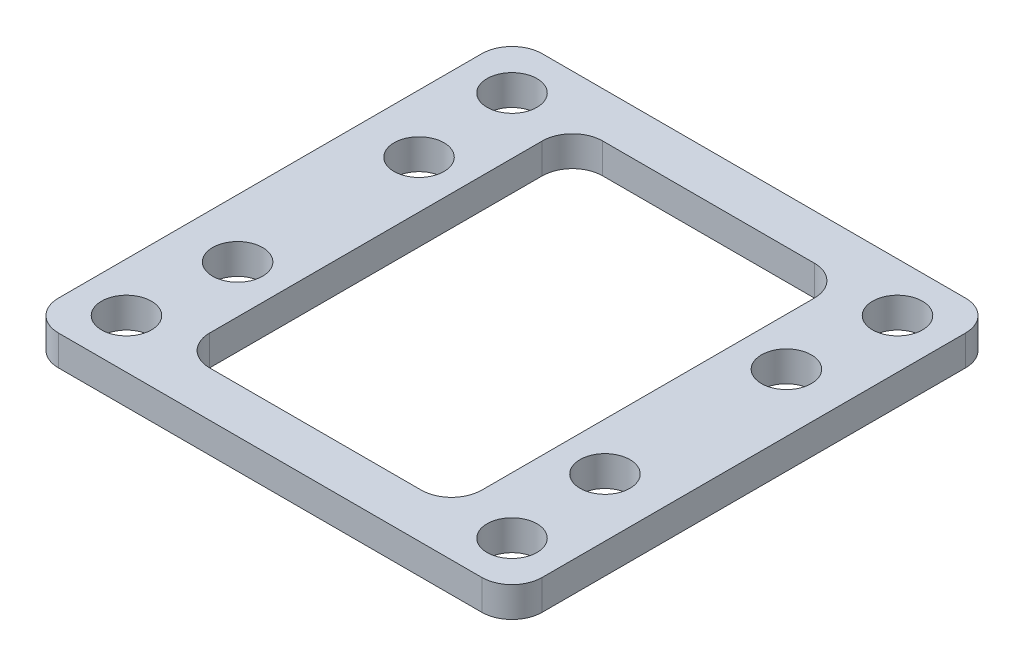
ISO-10303-21;
HEADER;
FILE_DESCRIPTION(('STEP AP214'),'2;1');
FILE_NAME('part.step','',(''),(''),'','','');
FILE_SCHEMA(('AUTOMOTIVE_DESIGN { 1 0 10303 214 1 1 1 1 }'));
ENDSEC;
DATA;
#1=APPLICATION_CONTEXT('core data for automotive mechanical design processes');
#2=APPLICATION_PROTOCOL_DEFINITION('international standard','automotive_design',2000,#1);
#3=PRODUCT_CONTEXT('',#1,'mechanical');
#4=PRODUCT('Part','Part','',(#3));
#5=PRODUCT_RELATED_PRODUCT_CATEGORY('part','',(#4));
#6=PRODUCT_DEFINITION_FORMATION('','',#4);
#7=PRODUCT_DEFINITION_CONTEXT('part definition',#1,'design');
#8=PRODUCT_DEFINITION('design','',#6,#7);
#9=PRODUCT_DEFINITION_SHAPE('','',#8);
#10=(LENGTH_UNIT() NAMED_UNIT(*) SI_UNIT(.MILLI.,.METRE.));
#11=(NAMED_UNIT(*) PLANE_ANGLE_UNIT() SI_UNIT($,.RADIAN.));
#12=(NAMED_UNIT(*) SI_UNIT($,.STERADIAN.) SOLID_ANGLE_UNIT());
#13=UNCERTAINTY_MEASURE_WITH_UNIT(LENGTH_MEASURE(1.E-05),#10,'distance_accuracy_value','');
#14=(GEOMETRIC_REPRESENTATION_CONTEXT(3) GLOBAL_UNCERTAINTY_ASSIGNED_CONTEXT((#13)) GLOBAL_UNIT_ASSIGNED_CONTEXT((#10,
#11,#12)) REPRESENTATION_CONTEXT('',''));
#15=CARTESIAN_POINT('',(0.,0.,0.));
#16=DIRECTION('',(0.,0.,1.));
#17=DIRECTION('',(1.,0.,0.));
#18=AXIS2_PLACEMENT_3D('',#15,#16,#17);
#19=CARTESIAN_POINT('',(0.,2.,0.));
#20=DIRECTION('',(0.,1.,0.));
#21=DIRECTION('',(0.,0.,1.));
#22=AXIS2_PLACEMENT_3D('',#19,#20,#21);
#23=PLANE('',#22);
#24=DIRECTION('',(0.,0.,1.));
#25=VECTOR('',#24,1.);
#26=CARTESIAN_POINT('',(-9.00000000000001,2.,13.));
#27=LINE('',#26,#25);
#28=CARTESIAN_POINT('',(-9.00000000000001,2.,-11.));
#29=VERTEX_POINT('',#28);
#30=CARTESIAN_POINT('',(-9.00000000000001,2.,11.));
#31=VERTEX_POINT('',#30);
#32=EDGE_CURVE('E255',#29,#31,#27,.T.);
#33=ORIENTED_EDGE('',*,*,#32,.F.);
#34=CARTESIAN_POINT('',(-7.00000000000001,2.,-11.));
#35=DIRECTION('',(0.,1.,0.));
#36=DIRECTION('',(0.,0.,1.));
#37=AXIS2_PLACEMENT_3D('',#34,#35,#36);
#38=CIRCLE('',#37,2.);
#39=CARTESIAN_POINT('',(-7.00000000000001,2.,-13.));
#40=VERTEX_POINT('',#39);
#41=EDGE_CURVE('E47',#29,#40,#38,.F.);
#42=ORIENTED_EDGE('',*,*,#41,.T.);
#43=DIRECTION('',(-1.,0.,0.));
#44=VECTOR('',#43,1.);
#45=CARTESIAN_POINT('',(9.00000000000001,2.,-13.));
#46=LINE('',#45,#44);
#47=CARTESIAN_POINT('',(7.00000000000001,2.,-13.));
#48=VERTEX_POINT('',#47);
#49=EDGE_CURVE('E253',#48,#40,#46,.T.);
#50=ORIENTED_EDGE('',*,*,#49,.F.);
#51=CARTESIAN_POINT('',(7.00000000000001,2.,-11.));
#52=DIRECTION('',(0.,1.,0.));
#53=DIRECTION('',(0.,0.,1.));
#54=AXIS2_PLACEMENT_3D('',#51,#52,#53);
#55=CIRCLE('',#54,2.);
#56=CARTESIAN_POINT('',(9.00000000000001,2.,-11.));
#57=VERTEX_POINT('',#56);
#58=EDGE_CURVE('E245',#48,#57,#55,.F.);
#59=ORIENTED_EDGE('',*,*,#58,.T.);
#60=DIRECTION('',(0.,0.,-1.));
#61=VECTOR('',#60,1.);
#62=CARTESIAN_POINT('',(9.00000000000001,2.,13.));
#63=LINE('',#62,#61);
#64=CARTESIAN_POINT('',(9.00000000000001,2.,11.));
#65=VERTEX_POINT('',#64);
#66=EDGE_CURVE('E265',#65,#57,#63,.T.);
#67=ORIENTED_EDGE('',*,*,#66,.F.);
#68=CARTESIAN_POINT('',(7.00000000000001,2.,11.));
#69=DIRECTION('',(0.,1.,0.));
#70=DIRECTION('',(0.,0.,1.));
#71=AXIS2_PLACEMENT_3D('',#68,#69,#70);
#72=CIRCLE('',#71,2.);
#73=CARTESIAN_POINT('',(7.00000000000001,2.,13.));
#74=VERTEX_POINT('',#73);
#75=EDGE_CURVE('E237',#65,#74,#72,.F.);
#76=ORIENTED_EDGE('',*,*,#75,.T.);
#77=DIRECTION('',(1.,0.,0.));
#78=VECTOR('',#77,1.);
#79=CARTESIAN_POINT('',(9.00000000000001,2.,13.));
#80=LINE('',#79,#78);
#81=CARTESIAN_POINT('',(-7.,2.,13.));
#82=VERTEX_POINT('',#81);
#83=EDGE_CURVE('E287',#82,#74,#80,.T.);
#84=ORIENTED_EDGE('',*,*,#83,.F.);
#85=CARTESIAN_POINT('',(-7.,2.,11.));
#86=DIRECTION('',(0.,1.,0.));
#87=DIRECTION('',(0.,0.,1.));
#88=AXIS2_PLACEMENT_3D('',#85,#86,#87);
#89=CIRCLE('',#88,2.);
#90=EDGE_CURVE('E241',#82,#31,#89,.F.);
#91=ORIENTED_EDGE('',*,*,#90,.T.);
#92=EDGE_LOOP('',(#33,#42,#50,#59,#67,#76,#84,#91));
#93=FACE_BOUND('',#92,.T.);
#94=CARTESIAN_POINT('',(12.15,2.,6.));
#95=DIRECTION('',(0.,1.,0.));
#96=DIRECTION('',(0.,0.,1.));
#97=AXIS2_PLACEMENT_3D('',#94,#95,#96);
#98=CIRCLE('',#97,1.65);
#99=CARTESIAN_POINT('',(12.15,2.,7.65));
#100=VERTEX_POINT('',#99);
#101=EDGE_CURVE('E298',#100,#100,#98,.T.);
#102=ORIENTED_EDGE('',*,*,#101,.F.);
#103=EDGE_LOOP('',(#102));
#104=FACE_BOUND('',#103,.T.);
#105=CARTESIAN_POINT('',(-12.15,2.,-6.));
#106=DIRECTION('',(0.,1.,0.));
#107=DIRECTION('',(0.,0.,1.));
#108=AXIS2_PLACEMENT_3D('',#105,#106,#107);
#109=CIRCLE('',#108,1.65);
#110=CARTESIAN_POINT('',(-12.15,2.,-4.35));
#111=VERTEX_POINT('',#110);
#112=EDGE_CURVE('E310',#111,#111,#109,.T.);
#113=ORIENTED_EDGE('',*,*,#112,.F.);
#114=EDGE_LOOP('',(#113));
#115=FACE_BOUND('',#114,.T.);
#116=CARTESIAN_POINT('',(12.75,2.,12.75));
#117=DIRECTION('',(0.,1.,0.));
#118=DIRECTION('',(0.,0.,1.));
#119=AXIS2_PLACEMENT_3D('',#116,#117,#118);
#120=CIRCLE('',#119,1.65);
#121=CARTESIAN_POINT('',(12.75,2.,14.4));
#122=VERTEX_POINT('',#121);
#123=EDGE_CURVE('E322',#122,#122,#120,.T.);
#124=ORIENTED_EDGE('',*,*,#123,.F.);
#125=EDGE_LOOP('',(#124));
#126=FACE_BOUND('',#125,.T.);
#127=CARTESIAN_POINT('',(-12.75,2.,-12.75));
#128=DIRECTION('',(0.,1.,0.));
#129=DIRECTION('',(0.,0.,1.));
#130=AXIS2_PLACEMENT_3D('',#127,#128,#129);
#131=CIRCLE('',#130,1.65);
#132=CARTESIAN_POINT('',(-12.75,2.,-11.1));
#133=VERTEX_POINT('',#132);
#134=EDGE_CURVE('E186',#133,#133,#131,.T.);
#135=ORIENTED_EDGE('',*,*,#134,.F.);
#136=EDGE_LOOP('',(#135));
#137=FACE_BOUND('',#136,.T.);
#138=DIRECTION('',(0.,0.,-1.));
#139=VECTOR('',#138,1.);
#140=CARTESIAN_POINT('',(16.,2.,-16.));
#141=LINE('',#140,#139);
#142=CARTESIAN_POINT('',(16.,2.,14.));
#143=VERTEX_POINT('',#142);
#144=CARTESIAN_POINT('',(16.,2.,-14.));
#145=VERTEX_POINT('',#144);
#146=EDGE_CURVE('E191',#143,#145,#141,.T.);
#147=ORIENTED_EDGE('',*,*,#146,.T.);
#148=CARTESIAN_POINT('',(14.,2.,-14.));
#149=DIRECTION('',(0.,1.,0.));
#150=DIRECTION('',(0.,0.,1.));
#151=AXIS2_PLACEMENT_3D('',#148,#149,#150);
#152=CIRCLE('',#151,2.);
#153=CARTESIAN_POINT('',(14.,2.,-16.));
#154=VERTEX_POINT('',#153);
#155=EDGE_CURVE('E206',#145,#154,#152,.T.);
#156=ORIENTED_EDGE('',*,*,#155,.T.);
#157=DIRECTION('',(-1.,0.,0.));
#158=VECTOR('',#157,1.);
#159=CARTESIAN_POINT('',(-16.,2.,-16.));
#160=LINE('',#159,#158);
#161=CARTESIAN_POINT('',(-14.,2.,-16.));
#162=VERTEX_POINT('',#161);
#163=EDGE_CURVE('E173',#154,#162,#160,.T.);
#164=ORIENTED_EDGE('',*,*,#163,.T.);
#165=CARTESIAN_POINT('',(-14.,2.,-14.));
#166=DIRECTION('',(0.,1.,0.));
#167=DIRECTION('',(0.,0.,1.));
#168=AXIS2_PLACEMENT_3D('',#165,#166,#167);
#169=CIRCLE('',#168,2.);
#170=CARTESIAN_POINT('',(-16.,2.,-14.));
#171=VERTEX_POINT('',#170);
#172=EDGE_CURVE('E204',#162,#171,#169,.T.);
#173=ORIENTED_EDGE('',*,*,#172,.T.);
#174=DIRECTION('',(0.,0.,1.));
#175=VECTOR('',#174,1.);
#176=CARTESIAN_POINT('',(-16.,2.,-16.));
#177=LINE('',#176,#175);
#178=CARTESIAN_POINT('',(-16.,2.,14.));
#179=VERTEX_POINT('',#178);
#180=EDGE_CURVE('E341',#171,#179,#177,.T.);
#181=ORIENTED_EDGE('',*,*,#180,.T.);
#182=CARTESIAN_POINT('',(-14.,2.,14.));
#183=DIRECTION('',(0.,1.,0.));
#184=DIRECTION('',(0.,0.,1.));
#185=AXIS2_PLACEMENT_3D('',#182,#183,#184);
#186=CIRCLE('',#185,2.);
#187=CARTESIAN_POINT('',(-14.,2.,16.));
#188=VERTEX_POINT('',#187);
#189=EDGE_CURVE('E61',#179,#188,#186,.T.);
#190=ORIENTED_EDGE('',*,*,#189,.T.);
#191=DIRECTION('',(1.,0.,0.));
#192=VECTOR('',#191,1.);
#193=CARTESIAN_POINT('',(-16.,2.,16.));
#194=LINE('',#193,#192);
#195=CARTESIAN_POINT('',(14.,2.,16.));
#196=VERTEX_POINT('',#195);
#197=EDGE_CURVE('E192',#188,#196,#194,.T.);
#198=ORIENTED_EDGE('',*,*,#197,.T.);
#199=CARTESIAN_POINT('',(14.,2.,14.));
#200=DIRECTION('',(0.,1.,0.));
#201=DIRECTION('',(0.,0.,1.));
#202=AXIS2_PLACEMENT_3D('',#199,#200,#201);
#203=CIRCLE('',#202,2.);
#204=EDGE_CURVE('E201',#196,#143,#203,.T.);
#205=ORIENTED_EDGE('',*,*,#204,.T.);
#206=EDGE_LOOP('',(#147,#156,#164,#173,#181,#190,#198,#205));
#207=FACE_BOUND('',#206,.T.);
#208=CARTESIAN_POINT('',(12.75,2.,-12.75));
#209=DIRECTION('',(0.,1.,0.));
#210=DIRECTION('',(0.,0.,-1.));
#211=AXIS2_PLACEMENT_3D('',#208,#209,#210);
#212=CIRCLE('',#211,1.65);
#213=CARTESIAN_POINT('',(12.75,2.,-14.4));
#214=VERTEX_POINT('',#213);
#215=EDGE_CURVE('E328',#214,#214,#212,.T.);
#216=ORIENTED_EDGE('',*,*,#215,.F.);
#217=EDGE_LOOP('',(#216));
#218=FACE_BOUND('',#217,.T.);
#219=CARTESIAN_POINT('',(-12.75,2.,12.75));
#220=DIRECTION('',(0.,1.,0.));
#221=DIRECTION('',(0.,0.,-1.));
#222=AXIS2_PLACEMENT_3D('',#219,#220,#221);
#223=CIRCLE('',#222,1.65);
#224=CARTESIAN_POINT('',(-12.75,2.,11.1));
#225=VERTEX_POINT('',#224);
#226=EDGE_CURVE('E316',#225,#225,#223,.T.);
#227=ORIENTED_EDGE('',*,*,#226,.F.);
#228=EDGE_LOOP('',(#227));
#229=FACE_BOUND('',#228,.T.);
#230=CARTESIAN_POINT('',(-12.15,2.,6.));
#231=DIRECTION('',(0.,1.,0.));
#232=DIRECTION('',(0.,0.,-1.));
#233=AXIS2_PLACEMENT_3D('',#230,#231,#232);
#234=CIRCLE('',#233,1.65);
#235=CARTESIAN_POINT('',(-12.15,2.,4.35));
#236=VERTEX_POINT('',#235);
#237=EDGE_CURVE('E304',#236,#236,#234,.T.);
#238=ORIENTED_EDGE('',*,*,#237,.F.);
#239=EDGE_LOOP('',(#238));
#240=FACE_BOUND('',#239,.T.);
#241=CARTESIAN_POINT('',(12.15,2.,-6.));
#242=DIRECTION('',(0.,1.,0.));
#243=DIRECTION('',(0.,0.,-1.));
#244=AXIS2_PLACEMENT_3D('',#241,#242,#243);
#245=CIRCLE('',#244,1.65);
#246=CARTESIAN_POINT('',(12.15,2.,-7.65));
#247=VERTEX_POINT('',#246);
#248=EDGE_CURVE('E292',#247,#247,#245,.T.);
#249=ORIENTED_EDGE('',*,*,#248,.F.);
#250=EDGE_LOOP('',(#249));
#251=FACE_BOUND('',#250,.T.);
#252=ADVANCED_FACE('F39',(#93,#104,#115,#126,#137,#207,#218,#229,#240,#251),#23,.T.);
#253=CARTESIAN_POINT('',(0.,0.,0.));
#254=DIRECTION('',(0.,1.,0.));
#255=DIRECTION('',(0.,0.,1.));
#256=AXIS2_PLACEMENT_3D('',#253,#254,#255);
#257=PLANE('',#256);
#258=DIRECTION('',(0.,0.,-1.));
#259=VECTOR('',#258,1.);
#260=CARTESIAN_POINT('',(9.00000000000001,0.,13.));
#261=LINE('',#260,#259);
#262=CARTESIAN_POINT('',(9.00000000000001,0.,11.));
#263=VERTEX_POINT('',#262);
#264=CARTESIAN_POINT('',(9.00000000000001,0.,-11.));
#265=VERTEX_POINT('',#264);
#266=EDGE_CURVE('E280',#263,#265,#261,.T.);
#267=ORIENTED_EDGE('',*,*,#266,.T.);
#268=CARTESIAN_POINT('',(7.00000000000001,0.,-11.));
#269=DIRECTION('',(0.,1.,0.));
#270=DIRECTION('',(0.,0.,1.));
#271=AXIS2_PLACEMENT_3D('',#268,#269,#270);
#272=CIRCLE('',#271,2.);
#273=CARTESIAN_POINT('',(7.00000000000001,0.,-13.));
#274=VERTEX_POINT('',#273);
#275=EDGE_CURVE('E247',#265,#274,#272,.T.);
#276=ORIENTED_EDGE('',*,*,#275,.T.);
#277=DIRECTION('',(-1.,0.,0.));
#278=VECTOR('',#277,1.);
#279=CARTESIAN_POINT('',(9.00000000000001,0.,-13.));
#280=LINE('',#279,#278);
#281=CARTESIAN_POINT('',(-7.00000000000001,0.,-13.));
#282=VERTEX_POINT('',#281);
#283=EDGE_CURVE('E273',#274,#282,#280,.T.);
#284=ORIENTED_EDGE('',*,*,#283,.T.);
#285=CARTESIAN_POINT('',(-7.00000000000001,0.,-11.));
#286=DIRECTION('',(0.,1.,0.));
#287=DIRECTION('',(0.,0.,1.));
#288=AXIS2_PLACEMENT_3D('',#285,#286,#287);
#289=CIRCLE('',#288,2.);
#290=CARTESIAN_POINT('',(-9.00000000000001,0.,-11.));
#291=VERTEX_POINT('',#290);
#292=EDGE_CURVE('E11',#282,#291,#289,.T.);
#293=ORIENTED_EDGE('',*,*,#292,.T.);
#294=DIRECTION('',(0.,0.,1.));
#295=VECTOR('',#294,1.);
#296=CARTESIAN_POINT('',(-9.00000000000001,0.,13.));
#297=LINE('',#296,#295);
#298=CARTESIAN_POINT('',(-9.00000000000001,0.,11.));
#299=VERTEX_POINT('',#298);
#300=EDGE_CURVE('E264',#291,#299,#297,.T.);
#301=ORIENTED_EDGE('',*,*,#300,.T.);
#302=CARTESIAN_POINT('',(-7.,0.,11.));
#303=DIRECTION('',(0.,1.,0.));
#304=DIRECTION('',(0.,0.,1.));
#305=AXIS2_PLACEMENT_3D('',#302,#303,#304);
#306=CIRCLE('',#305,2.);
#307=CARTESIAN_POINT('',(-7.,0.,13.));
#308=VERTEX_POINT('',#307);
#309=EDGE_CURVE('E243',#299,#308,#306,.T.);
#310=ORIENTED_EDGE('',*,*,#309,.T.);
#311=DIRECTION('',(1.,0.,0.));
#312=VECTOR('',#311,1.);
#313=CARTESIAN_POINT('',(9.00000000000001,0.,13.));
#314=LINE('',#313,#312);
#315=CARTESIAN_POINT('',(7.00000000000001,0.,13.));
#316=VERTEX_POINT('',#315);
#317=EDGE_CURVE('E277',#308,#316,#314,.T.);
#318=ORIENTED_EDGE('',*,*,#317,.T.);
#319=CARTESIAN_POINT('',(7.00000000000001,0.,11.));
#320=DIRECTION('',(0.,1.,0.));
#321=DIRECTION('',(0.,0.,1.));
#322=AXIS2_PLACEMENT_3D('',#319,#320,#321);
#323=CIRCLE('',#322,2.);
#324=EDGE_CURVE('E239',#316,#263,#323,.T.);
#325=ORIENTED_EDGE('',*,*,#324,.T.);
#326=EDGE_LOOP('',(#267,#276,#284,#293,#301,#310,#318,#325));
#327=FACE_BOUND('',#326,.T.);
#328=DIRECTION('',(-1.,0.,0.));
#329=VECTOR('',#328,1.);
#330=CARTESIAN_POINT('',(-16.,0.,-16.));
#331=LINE('',#330,#329);
#332=CARTESIAN_POINT('',(14.,0.,-16.));
#333=VERTEX_POINT('',#332);
#334=CARTESIAN_POINT('',(-14.,0.,-16.));
#335=VERTEX_POINT('',#334);
#336=EDGE_CURVE('E170',#333,#335,#331,.T.);
#337=ORIENTED_EDGE('',*,*,#336,.F.);
#338=CARTESIAN_POINT('',(14.,0.,-14.));
#339=DIRECTION('',(0.,1.,0.));
#340=DIRECTION('',(0.,0.,1.));
#341=AXIS2_PLACEMENT_3D('',#338,#339,#340);
#342=CIRCLE('',#341,2.);
#343=CARTESIAN_POINT('',(16.,0.,-14.));
#344=VERTEX_POINT('',#343);
#345=EDGE_CURVE('E153',#333,#344,#342,.F.);
#346=ORIENTED_EDGE('',*,*,#345,.T.);
#347=DIRECTION('',(0.,0.,-1.));
#348=VECTOR('',#347,1.);
#349=CARTESIAN_POINT('',(16.,0.,-16.));
#350=LINE('',#349,#348);
#351=CARTESIAN_POINT('',(16.,0.,14.));
#352=VERTEX_POINT('',#351);
#353=EDGE_CURVE('E181',#352,#344,#350,.T.);
#354=ORIENTED_EDGE('',*,*,#353,.F.);
#355=CARTESIAN_POINT('',(14.,0.,14.));
#356=DIRECTION('',(0.,1.,0.));
#357=DIRECTION('',(0.,0.,1.));
#358=AXIS2_PLACEMENT_3D('',#355,#356,#357);
#359=CIRCLE('',#358,2.);
#360=CARTESIAN_POINT('',(14.,0.,16.));
#361=VERTEX_POINT('',#360);
#362=EDGE_CURVE('E174',#352,#361,#359,.F.);
#363=ORIENTED_EDGE('',*,*,#362,.T.);
#364=DIRECTION('',(1.,0.,0.));
#365=VECTOR('',#364,1.);
#366=CARTESIAN_POINT('',(-16.,0.,16.));
#367=LINE('',#366,#365);
#368=CARTESIAN_POINT('',(-14.,0.,16.));
#369=VERTEX_POINT('',#368);
#370=EDGE_CURVE('E184',#369,#361,#367,.T.);
#371=ORIENTED_EDGE('',*,*,#370,.F.);
#372=CARTESIAN_POINT('',(-14.,0.,14.));
#373=DIRECTION('',(0.,1.,0.));
#374=DIRECTION('',(0.,0.,1.));
#375=AXIS2_PLACEMENT_3D('',#372,#373,#374);
#376=CIRCLE('',#375,2.);
#377=CARTESIAN_POINT('',(-16.,0.,14.));
#378=VERTEX_POINT('',#377);
#379=EDGE_CURVE('E195',#369,#378,#376,.F.);
#380=ORIENTED_EDGE('',*,*,#379,.T.);
#381=DIRECTION('',(0.,0.,1.));
#382=VECTOR('',#381,1.);
#383=CARTESIAN_POINT('',(-16.,0.,-16.));
#384=LINE('',#383,#382);
#385=CARTESIAN_POINT('',(-16.,0.,-14.));
#386=VERTEX_POINT('',#385);
#387=EDGE_CURVE('E180',#386,#378,#384,.T.);
#388=ORIENTED_EDGE('',*,*,#387,.F.);
#389=CARTESIAN_POINT('',(-14.,0.,-14.));
#390=DIRECTION('',(0.,1.,0.));
#391=DIRECTION('',(0.,0.,1.));
#392=AXIS2_PLACEMENT_3D('',#389,#390,#391);
#393=CIRCLE('',#392,2.);
#394=EDGE_CURVE('E164',#386,#335,#393,.F.);
#395=ORIENTED_EDGE('',*,*,#394,.T.);
#396=EDGE_LOOP('',(#337,#346,#354,#363,#371,#380,#388,#395));
#397=FACE_BOUND('',#396,.T.);
#398=CARTESIAN_POINT('',(-12.75,0.,-12.75));
#399=DIRECTION('',(0.,1.,0.));
#400=DIRECTION('',(0.,0.,1.));
#401=AXIS2_PLACEMENT_3D('',#398,#399,#400);
#402=CIRCLE('',#401,1.65);
#403=CARTESIAN_POINT('',(-12.75,0.,-11.1));
#404=VERTEX_POINT('',#403);
#405=EDGE_CURVE('E331',#404,#404,#402,.T.);
#406=ORIENTED_EDGE('',*,*,#405,.T.);
#407=EDGE_LOOP('',(#406));
#408=FACE_BOUND('',#407,.T.);
#409=CARTESIAN_POINT('',(12.75,0.,-12.75));
#410=DIRECTION('',(0.,1.,0.));
#411=DIRECTION('',(0.,0.,-1.));
#412=AXIS2_PLACEMENT_3D('',#409,#410,#411);
#413=CIRCLE('',#412,1.65);
#414=CARTESIAN_POINT('',(12.75,0.,-14.4));
#415=VERTEX_POINT('',#414);
#416=EDGE_CURVE('E325',#415,#415,#413,.T.);
#417=ORIENTED_EDGE('',*,*,#416,.T.);
#418=EDGE_LOOP('',(#417));
#419=FACE_BOUND('',#418,.T.);
#420=CARTESIAN_POINT('',(12.75,0.,12.75));
#421=DIRECTION('',(0.,1.,0.));
#422=DIRECTION('',(0.,0.,1.));
#423=AXIS2_PLACEMENT_3D('',#420,#421,#422);
#424=CIRCLE('',#423,1.65);
#425=CARTESIAN_POINT('',(12.75,0.,14.4));
#426=VERTEX_POINT('',#425);
#427=EDGE_CURVE('E319',#426,#426,#424,.T.);
#428=ORIENTED_EDGE('',*,*,#427,.T.);
#429=EDGE_LOOP('',(#428));
#430=FACE_BOUND('',#429,.T.);
#431=CARTESIAN_POINT('',(-12.75,0.,12.75));
#432=DIRECTION('',(0.,1.,0.));
#433=DIRECTION('',(0.,0.,-1.));
#434=AXIS2_PLACEMENT_3D('',#431,#432,#433);
#435=CIRCLE('',#434,1.65);
#436=CARTESIAN_POINT('',(-12.75,0.,11.1));
#437=VERTEX_POINT('',#436);
#438=EDGE_CURVE('E313',#437,#437,#435,.T.);
#439=ORIENTED_EDGE('',*,*,#438,.T.);
#440=EDGE_LOOP('',(#439));
#441=FACE_BOUND('',#440,.T.);
#442=CARTESIAN_POINT('',(-12.15,0.,-6.));
#443=DIRECTION('',(0.,1.,0.));
#444=DIRECTION('',(0.,0.,1.));
#445=AXIS2_PLACEMENT_3D('',#442,#443,#444);
#446=CIRCLE('',#445,1.65);
#447=CARTESIAN_POINT('',(-12.15,0.,-4.35));
#448=VERTEX_POINT('',#447);
#449=EDGE_CURVE('E307',#448,#448,#446,.T.);
#450=ORIENTED_EDGE('',*,*,#449,.T.);
#451=EDGE_LOOP('',(#450));
#452=FACE_BOUND('',#451,.T.);
#453=CARTESIAN_POINT('',(-12.15,0.,6.));
#454=DIRECTION('',(0.,1.,0.));
#455=DIRECTION('',(0.,0.,-1.));
#456=AXIS2_PLACEMENT_3D('',#453,#454,#455);
#457=CIRCLE('',#456,1.65);
#458=CARTESIAN_POINT('',(-12.15,0.,4.35));
#459=VERTEX_POINT('',#458);
#460=EDGE_CURVE('E301',#459,#459,#457,.T.);
#461=ORIENTED_EDGE('',*,*,#460,.T.);
#462=EDGE_LOOP('',(#461));
#463=FACE_BOUND('',#462,.T.);
#464=CARTESIAN_POINT('',(12.15,0.,6.));
#465=DIRECTION('',(0.,1.,0.));
#466=DIRECTION('',(0.,0.,1.));
#467=AXIS2_PLACEMENT_3D('',#464,#465,#466);
#468=CIRCLE('',#467,1.65);
#469=CARTESIAN_POINT('',(12.15,0.,7.65));
#470=VERTEX_POINT('',#469);
#471=EDGE_CURVE('E295',#470,#470,#468,.T.);
#472=ORIENTED_EDGE('',*,*,#471,.T.);
#473=EDGE_LOOP('',(#472));
#474=FACE_BOUND('',#473,.T.);
#475=CARTESIAN_POINT('',(12.15,0.,-6.));
#476=DIRECTION('',(0.,1.,0.));
#477=DIRECTION('',(0.,0.,-1.));
#478=AXIS2_PLACEMENT_3D('',#475,#476,#477);
#479=CIRCLE('',#478,1.65);
#480=CARTESIAN_POINT('',(12.15,0.,-7.65));
#481=VERTEX_POINT('',#480);
#482=EDGE_CURVE('E285',#481,#481,#479,.T.);
#483=ORIENTED_EDGE('',*,*,#482,.T.);
#484=EDGE_LOOP('',(#483));
#485=FACE_BOUND('',#484,.T.);
#486=ADVANCED_FACE('F177',(#327,#397,#408,#419,#430,#441,#452,#463,#474,#485),#257,.F.);
#487=CARTESIAN_POINT('',(16.,2.,-16.));
#488=DIRECTION('',(-1.,0.,0.));
#489=DIRECTION('',(0.,0.,1.));
#490=AXIS2_PLACEMENT_3D('',#487,#488,#489);
#491=PLANE('',#490);
#492=ORIENTED_EDGE('',*,*,#353,.T.);
#493=DIRECTION('',(0.,-1.,0.));
#494=VECTOR('',#493,1.);
#495=CARTESIAN_POINT('',(16.,2.,-14.));
#496=LINE('',#495,#494);
#497=EDGE_CURVE('E158',#344,#145,#496,.F.);
#498=ORIENTED_EDGE('',*,*,#497,.T.);
#499=ORIENTED_EDGE('',*,*,#146,.F.);
#500=DIRECTION('',(0.,-1.,0.));
#501=VECTOR('',#500,1.);
#502=CARTESIAN_POINT('',(16.,2.,14.));
#503=LINE('',#502,#501);
#504=EDGE_CURVE('E163',#143,#352,#503,.T.);
#505=ORIENTED_EDGE('',*,*,#504,.T.);
#506=EDGE_LOOP('',(#492,#498,#499,#505));
#507=FACE_BOUND('',#506,.T.);
#508=ADVANCED_FACE('F350',(#507),#491,.F.);
#509=CARTESIAN_POINT('',(-16.,2.,-16.));
#510=DIRECTION('',(0.,0.,1.));
#511=DIRECTION('',(1.,0.,0.));
#512=AXIS2_PLACEMENT_3D('',#509,#510,#511);
#513=PLANE('',#512);
#514=ORIENTED_EDGE('',*,*,#163,.F.);
#515=DIRECTION('',(0.,-1.,0.));
#516=VECTOR('',#515,1.);
#517=CARTESIAN_POINT('',(14.,2.,-16.));
#518=LINE('',#517,#516);
#519=EDGE_CURVE('E157',#154,#333,#518,.T.);
#520=ORIENTED_EDGE('',*,*,#519,.T.);
#521=ORIENTED_EDGE('',*,*,#336,.T.);
#522=DIRECTION('',(0.,-1.,0.));
#523=VECTOR('',#522,1.);
#524=CARTESIAN_POINT('',(-14.,2.,-16.));
#525=LINE('',#524,#523);
#526=EDGE_CURVE('E175',#335,#162,#525,.F.);
#527=ORIENTED_EDGE('',*,*,#526,.T.);
#528=EDGE_LOOP('',(#514,#520,#521,#527));
#529=FACE_BOUND('',#528,.T.);
#530=ADVANCED_FACE('F169',(#529),#513,.F.);
#531=CARTESIAN_POINT('',(-16.,2.,-16.));
#532=DIRECTION('',(1.,0.,0.));
#533=DIRECTION('',(0.,0.,-1.));
#534=AXIS2_PLACEMENT_3D('',#531,#532,#533);
#535=PLANE('',#534);
#536=ORIENTED_EDGE('',*,*,#180,.F.);
#537=DIRECTION('',(0.,-1.,0.));
#538=VECTOR('',#537,1.);
#539=CARTESIAN_POINT('',(-16.,2.,-14.));
#540=LINE('',#539,#538);
#541=EDGE_CURVE('E210',#171,#386,#540,.T.);
#542=ORIENTED_EDGE('',*,*,#541,.T.);
#543=ORIENTED_EDGE('',*,*,#387,.T.);
#544=DIRECTION('',(0.,-1.,0.));
#545=VECTOR('',#544,1.);
#546=CARTESIAN_POINT('',(-16.,2.,14.));
#547=LINE('',#546,#545);
#548=EDGE_CURVE('E208',#378,#179,#547,.F.);
#549=ORIENTED_EDGE('',*,*,#548,.T.);
#550=EDGE_LOOP('',(#536,#542,#543,#549));
#551=FACE_BOUND('',#550,.T.);
#552=ADVANCED_FACE('F358',(#551),#535,.F.);
#553=CARTESIAN_POINT('',(-16.,2.,16.));
#554=DIRECTION('',(0.,0.,-1.));
#555=DIRECTION('',(-1.,0.,0.));
#556=AXIS2_PLACEMENT_3D('',#553,#554,#555);
#557=PLANE('',#556);
#558=ORIENTED_EDGE('',*,*,#197,.F.);
#559=DIRECTION('',(0.,-1.,0.));
#560=VECTOR('',#559,1.);
#561=CARTESIAN_POINT('',(-14.,2.,16.));
#562=LINE('',#561,#560);
#563=EDGE_CURVE('E214',#188,#369,#562,.T.);
#564=ORIENTED_EDGE('',*,*,#563,.T.);
#565=ORIENTED_EDGE('',*,*,#370,.T.);
#566=DIRECTION('',(0.,-1.,0.));
#567=VECTOR('',#566,1.);
#568=CARTESIAN_POINT('',(14.,2.,16.));
#569=LINE('',#568,#567);
#570=EDGE_CURVE('E54',#361,#196,#569,.F.);
#571=ORIENTED_EDGE('',*,*,#570,.T.);
#572=EDGE_LOOP('',(#558,#564,#565,#571));
#573=FACE_BOUND('',#572,.T.);
#574=ADVANCED_FACE('F352',(#573),#557,.F.);
#575=CARTESIAN_POINT('',(-12.75,2.,-12.75));
#576=DIRECTION('',(0.,-1.,0.));
#577=DIRECTION('',(0.,0.,-1.));
#578=AXIS2_PLACEMENT_3D('',#575,#576,#577);
#579=CYLINDRICAL_SURFACE('',#578,1.65);
#580=ORIENTED_EDGE('',*,*,#134,.T.);
#581=EDGE_LOOP('',(#580));
#582=FACE_BOUND('',#581,.T.);
#583=ORIENTED_EDGE('',*,*,#405,.F.);
#584=EDGE_LOOP('',(#583));
#585=FACE_BOUND('',#584,.T.);
#586=ADVANCED_FACE('F380',(#582,#585),#579,.F.);
#587=CARTESIAN_POINT('',(12.75,2.,-12.75));
#588=DIRECTION('',(0.,-1.,0.));
#589=DIRECTION('',(0.,0.,-1.));
#590=AXIS2_PLACEMENT_3D('',#587,#588,#589);
#591=CYLINDRICAL_SURFACE('',#590,1.65);
#592=ORIENTED_EDGE('',*,*,#215,.T.);
#593=EDGE_LOOP('',(#592));
#594=FACE_BOUND('',#593,.T.);
#595=ORIENTED_EDGE('',*,*,#416,.F.);
#596=EDGE_LOOP('',(#595));
#597=FACE_BOUND('',#596,.T.);
#598=ADVANCED_FACE('F568',(#594,#597),#591,.F.);
#599=CARTESIAN_POINT('',(12.75,2.,12.75));
#600=DIRECTION('',(0.,-1.,0.));
#601=DIRECTION('',(0.,0.,-1.));
#602=AXIS2_PLACEMENT_3D('',#599,#600,#601);
#603=CYLINDRICAL_SURFACE('',#602,1.65);
#604=ORIENTED_EDGE('',*,*,#123,.T.);
#605=EDGE_LOOP('',(#604));
#606=FACE_BOUND('',#605,.T.);
#607=ORIENTED_EDGE('',*,*,#427,.F.);
#608=EDGE_LOOP('',(#607));
#609=FACE_BOUND('',#608,.T.);
#610=ADVANCED_FACE('F559',(#606,#609),#603,.F.);
#611=CARTESIAN_POINT('',(-12.75,2.,12.75));
#612=DIRECTION('',(0.,-1.,0.));
#613=DIRECTION('',(0.,0.,-1.));
#614=AXIS2_PLACEMENT_3D('',#611,#612,#613);
#615=CYLINDRICAL_SURFACE('',#614,1.65);
#616=ORIENTED_EDGE('',*,*,#226,.T.);
#617=EDGE_LOOP('',(#616));
#618=FACE_BOUND('',#617,.T.);
#619=ORIENTED_EDGE('',*,*,#438,.F.);
#620=EDGE_LOOP('',(#619));
#621=FACE_BOUND('',#620,.T.);
#622=ADVANCED_FACE('F550',(#618,#621),#615,.F.);
#623=CARTESIAN_POINT('',(-12.15,2.,-6.));
#624=DIRECTION('',(0.,-1.,0.));
#625=DIRECTION('',(0.,0.,-1.));
#626=AXIS2_PLACEMENT_3D('',#623,#624,#625);
#627=CYLINDRICAL_SURFACE('',#626,1.65);
#628=ORIENTED_EDGE('',*,*,#112,.T.);
#629=EDGE_LOOP('',(#628));
#630=FACE_BOUND('',#629,.T.);
#631=ORIENTED_EDGE('',*,*,#449,.F.);
#632=EDGE_LOOP('',(#631));
#633=FACE_BOUND('',#632,.T.);
#634=ADVANCED_FACE('F541',(#630,#633),#627,.F.);
#635=CARTESIAN_POINT('',(-12.15,2.,6.));
#636=DIRECTION('',(0.,-1.,0.));
#637=DIRECTION('',(0.,0.,-1.));
#638=AXIS2_PLACEMENT_3D('',#635,#636,#637);
#639=CYLINDRICAL_SURFACE('',#638,1.65);
#640=ORIENTED_EDGE('',*,*,#237,.T.);
#641=EDGE_LOOP('',(#640));
#642=FACE_BOUND('',#641,.T.);
#643=ORIENTED_EDGE('',*,*,#460,.F.);
#644=EDGE_LOOP('',(#643));
#645=FACE_BOUND('',#644,.T.);
#646=ADVANCED_FACE('F532',(#642,#645),#639,.F.);
#647=CARTESIAN_POINT('',(12.15,2.,6.));
#648=DIRECTION('',(0.,-1.,0.));
#649=DIRECTION('',(0.,0.,-1.));
#650=AXIS2_PLACEMENT_3D('',#647,#648,#649);
#651=CYLINDRICAL_SURFACE('',#650,1.65);
#652=ORIENTED_EDGE('',*,*,#101,.T.);
#653=EDGE_LOOP('',(#652));
#654=FACE_BOUND('',#653,.T.);
#655=ORIENTED_EDGE('',*,*,#471,.F.);
#656=EDGE_LOOP('',(#655));
#657=FACE_BOUND('',#656,.T.);
#658=ADVANCED_FACE('F523',(#654,#657),#651,.F.);
#659=CARTESIAN_POINT('',(12.15,2.,-6.));
#660=DIRECTION('',(0.,-1.,0.));
#661=DIRECTION('',(0.,0.,-1.));
#662=AXIS2_PLACEMENT_3D('',#659,#660,#661);
#663=CYLINDRICAL_SURFACE('',#662,1.65);
#664=ORIENTED_EDGE('',*,*,#248,.T.);
#665=EDGE_LOOP('',(#664));
#666=FACE_BOUND('',#665,.T.);
#667=ORIENTED_EDGE('',*,*,#482,.F.);
#668=EDGE_LOOP('',(#667));
#669=FACE_BOUND('',#668,.T.);
#670=ADVANCED_FACE('F417',(#666,#669),#663,.F.);
#671=CARTESIAN_POINT('',(-9.00000000000001,0.,13.));
#672=DIRECTION('',(-1.,0.,0.));
#673=DIRECTION('',(0.,0.,1.));
#674=AXIS2_PLACEMENT_3D('',#671,#672,#673);
#675=PLANE('',#674);
#676=ORIENTED_EDGE('',*,*,#32,.T.);
#677=DIRECTION('',(0.,1.,0.));
#678=VECTOR('',#677,1.);
#679=CARTESIAN_POINT('',(-9.00000000000001,0.,11.));
#680=LINE('',#679,#678);
#681=EDGE_CURVE('E230',#31,#299,#680,.F.);
#682=ORIENTED_EDGE('',*,*,#681,.T.);
#683=ORIENTED_EDGE('',*,*,#300,.F.);
#684=DIRECTION('',(0.,1.,0.));
#685=VECTOR('',#684,1.);
#686=CARTESIAN_POINT('',(-9.00000000000001,2.,-11.));
#687=LINE('',#686,#685);
#688=EDGE_CURVE('E227',#291,#29,#687,.T.);
#689=ORIENTED_EDGE('',*,*,#688,.T.);
#690=EDGE_LOOP('',(#676,#682,#683,#689));
#691=FACE_BOUND('',#690,.T.);
#692=ADVANCED_FACE('F275',(#691),#675,.F.);
#693=CARTESIAN_POINT('',(9.00000000000001,0.,-13.));
#694=DIRECTION('',(0.,0.,-1.));
#695=DIRECTION('',(-1.,0.,0.));
#696=AXIS2_PLACEMENT_3D('',#693,#694,#695);
#697=PLANE('',#696);
#698=ORIENTED_EDGE('',*,*,#283,.F.);
#699=DIRECTION('',(0.,1.,0.));
#700=VECTOR('',#699,1.);
#701=CARTESIAN_POINT('',(7.00000000000001,2.,-13.));
#702=LINE('',#701,#700);
#703=EDGE_CURVE('E234',#274,#48,#702,.T.);
#704=ORIENTED_EDGE('',*,*,#703,.T.);
#705=ORIENTED_EDGE('',*,*,#49,.T.);
#706=DIRECTION('',(0.,1.,0.));
#707=VECTOR('',#706,1.);
#708=CARTESIAN_POINT('',(-7.00000000000001,0.,-13.));
#709=LINE('',#708,#707);
#710=EDGE_CURVE('E232',#40,#282,#709,.F.);
#711=ORIENTED_EDGE('',*,*,#710,.T.);
#712=EDGE_LOOP('',(#698,#704,#705,#711));
#713=FACE_BOUND('',#712,.T.);
#714=ADVANCED_FACE('F261',(#713),#697,.F.);
#715=CARTESIAN_POINT('',(9.00000000000001,0.,13.));
#716=DIRECTION('',(1.,0.,0.));
#717=DIRECTION('',(0.,0.,-1.));
#718=AXIS2_PLACEMENT_3D('',#715,#716,#717);
#719=PLANE('',#718);
#720=ORIENTED_EDGE('',*,*,#266,.F.);
#721=DIRECTION('',(0.,1.,0.));
#722=VECTOR('',#721,1.);
#723=CARTESIAN_POINT('',(9.00000000000001,2.,11.));
#724=LINE('',#723,#722);
#725=EDGE_CURVE('E219',#263,#65,#724,.T.);
#726=ORIENTED_EDGE('',*,*,#725,.T.);
#727=ORIENTED_EDGE('',*,*,#66,.T.);
#728=DIRECTION('',(0.,1.,0.));
#729=VECTOR('',#728,1.);
#730=CARTESIAN_POINT('',(9.00000000000001,0.,-11.));
#731=LINE('',#730,#729);
#732=EDGE_CURVE('E217',#57,#265,#731,.F.);
#733=ORIENTED_EDGE('',*,*,#732,.T.);
#734=EDGE_LOOP('',(#720,#726,#727,#733));
#735=FACE_BOUND('',#734,.T.);
#736=ADVANCED_FACE('F426',(#735),#719,.F.);
#737=CARTESIAN_POINT('',(9.00000000000001,0.,13.));
#738=DIRECTION('',(0.,0.,1.));
#739=DIRECTION('',(1.,0.,0.));
#740=AXIS2_PLACEMENT_3D('',#737,#738,#739);
#741=PLANE('',#740);
#742=ORIENTED_EDGE('',*,*,#83,.T.);
#743=DIRECTION('',(0.,1.,0.));
#744=VECTOR('',#743,1.);
#745=CARTESIAN_POINT('',(7.00000000000001,0.,13.));
#746=LINE('',#745,#744);
#747=EDGE_CURVE('E225',#74,#316,#746,.F.);
#748=ORIENTED_EDGE('',*,*,#747,.T.);
#749=ORIENTED_EDGE('',*,*,#317,.F.);
#750=DIRECTION('',(0.,1.,0.));
#751=VECTOR('',#750,1.);
#752=CARTESIAN_POINT('',(-7.,2.,13.));
#753=LINE('',#752,#751);
#754=EDGE_CURVE('E222',#308,#82,#753,.T.);
#755=ORIENTED_EDGE('',*,*,#754,.T.);
#756=EDGE_LOOP('',(#742,#748,#749,#755));
#757=FACE_BOUND('',#756,.T.);
#758=ADVANCED_FACE('F370',(#757),#741,.F.);
#759=CARTESIAN_POINT('',(14.,2.,-14.));
#760=DIRECTION('',(0.,-1.,0.));
#761=DIRECTION('',(0.,0.,-1.));
#762=AXIS2_PLACEMENT_3D('',#759,#760,#761);
#763=CYLINDRICAL_SURFACE('',#762,2.);
#764=ORIENTED_EDGE('',*,*,#155,.F.);
#765=ORIENTED_EDGE('',*,*,#497,.F.);
#766=ORIENTED_EDGE('',*,*,#345,.F.);
#767=ORIENTED_EDGE('',*,*,#519,.F.);
#768=EDGE_LOOP('',(#764,#765,#766,#767));
#769=FACE_BOUND('',#768,.T.);
#770=ADVANCED_FACE('F156',(#769),#763,.T.);
#771=CARTESIAN_POINT('',(-14.,2.,-14.));
#772=DIRECTION('',(0.,-1.,0.));
#773=DIRECTION('',(0.,0.,-1.));
#774=AXIS2_PLACEMENT_3D('',#771,#772,#773);
#775=CYLINDRICAL_SURFACE('',#774,2.);
#776=ORIENTED_EDGE('',*,*,#172,.F.);
#777=ORIENTED_EDGE('',*,*,#526,.F.);
#778=ORIENTED_EDGE('',*,*,#394,.F.);
#779=ORIENTED_EDGE('',*,*,#541,.F.);
#780=EDGE_LOOP('',(#776,#777,#778,#779));
#781=FACE_BOUND('',#780,.T.);
#782=ADVANCED_FACE('F362',(#781),#775,.T.);
#783=CARTESIAN_POINT('',(-14.,2.,14.));
#784=DIRECTION('',(0.,-1.,0.));
#785=DIRECTION('',(0.,0.,-1.));
#786=AXIS2_PLACEMENT_3D('',#783,#784,#785);
#787=CYLINDRICAL_SURFACE('',#786,2.);
#788=ORIENTED_EDGE('',*,*,#189,.F.);
#789=ORIENTED_EDGE('',*,*,#548,.F.);
#790=ORIENTED_EDGE('',*,*,#379,.F.);
#791=ORIENTED_EDGE('',*,*,#563,.F.);
#792=EDGE_LOOP('',(#788,#789,#790,#791));
#793=FACE_BOUND('',#792,.T.);
#794=ADVANCED_FACE('F354',(#793),#787,.T.);
#795=CARTESIAN_POINT('',(14.,2.,14.));
#796=DIRECTION('',(0.,-1.,0.));
#797=DIRECTION('',(0.,0.,-1.));
#798=AXIS2_PLACEMENT_3D('',#795,#796,#797);
#799=CYLINDRICAL_SURFACE('',#798,2.);
#800=ORIENTED_EDGE('',*,*,#204,.F.);
#801=ORIENTED_EDGE('',*,*,#570,.F.);
#802=ORIENTED_EDGE('',*,*,#362,.F.);
#803=ORIENTED_EDGE('',*,*,#504,.F.);
#804=EDGE_LOOP('',(#800,#801,#802,#803));
#805=FACE_BOUND('',#804,.T.);
#806=ADVANCED_FACE('F348',(#805),#799,.T.);
#807=CARTESIAN_POINT('',(7.00000000000001,0.,11.));
#808=DIRECTION('',(0.,-1.,0.));
#809=DIRECTION('',(0.,0.,-1.));
#810=AXIS2_PLACEMENT_3D('',#807,#808,#809);
#811=CYLINDRICAL_SURFACE('',#810,2.);
#812=ORIENTED_EDGE('',*,*,#324,.F.);
#813=ORIENTED_EDGE('',*,*,#747,.F.);
#814=ORIENTED_EDGE('',*,*,#75,.F.);
#815=ORIENTED_EDGE('',*,*,#725,.F.);
#816=EDGE_LOOP('',(#812,#813,#814,#815));
#817=FACE_BOUND('',#816,.T.);
#818=ADVANCED_FACE('F468',(#817),#811,.F.);
#819=CARTESIAN_POINT('',(-7.,0.,11.));
#820=DIRECTION('',(0.,-1.,0.));
#821=DIRECTION('',(0.,0.,-1.));
#822=AXIS2_PLACEMENT_3D('',#819,#820,#821);
#823=CYLINDRICAL_SURFACE('',#822,2.);
#824=ORIENTED_EDGE('',*,*,#309,.F.);
#825=ORIENTED_EDGE('',*,*,#681,.F.);
#826=ORIENTED_EDGE('',*,*,#90,.F.);
#827=ORIENTED_EDGE('',*,*,#754,.F.);
#828=EDGE_LOOP('',(#824,#825,#826,#827));
#829=FACE_BOUND('',#828,.T.);
#830=ADVANCED_FACE('F477',(#829),#823,.F.);
#831=CARTESIAN_POINT('',(7.00000000000001,0.,-11.));
#832=DIRECTION('',(0.,-1.,0.));
#833=DIRECTION('',(0.,0.,-1.));
#834=AXIS2_PLACEMENT_3D('',#831,#832,#833);
#835=CYLINDRICAL_SURFACE('',#834,2.);
#836=ORIENTED_EDGE('',*,*,#275,.F.);
#837=ORIENTED_EDGE('',*,*,#732,.F.);
#838=ORIENTED_EDGE('',*,*,#58,.F.);
#839=ORIENTED_EDGE('',*,*,#703,.F.);
#840=EDGE_LOOP('',(#836,#837,#838,#839));
#841=FACE_BOUND('',#840,.T.);
#842=ADVANCED_FACE('F487',(#841),#835,.F.);
#843=CARTESIAN_POINT('',(-7.00000000000001,0.,-11.));
#844=DIRECTION('',(0.,-1.,0.));
#845=DIRECTION('',(0.,0.,-1.));
#846=AXIS2_PLACEMENT_3D('',#843,#844,#845);
#847=CYLINDRICAL_SURFACE('',#846,2.);
#848=ORIENTED_EDGE('',*,*,#292,.F.);
#849=ORIENTED_EDGE('',*,*,#710,.F.);
#850=ORIENTED_EDGE('',*,*,#41,.F.);
#851=ORIENTED_EDGE('',*,*,#688,.F.);
#852=EDGE_LOOP('',(#848,#849,#850,#851));
#853=FACE_BOUND('',#852,.T.);
#854=ADVANCED_FACE('F41',(#853),#847,.F.);
#855=CLOSED_SHELL('',(#252,#486,#508,#530,#552,#574,#586,#598,#610,#622,#634,#646,#658,#670,
#692,#714,#736,#758,#770,#782,#794,#806,#818,#830,#842,#854));
#856=MANIFOLD_SOLID_BREP('B2',#855);
#857=ADVANCED_BREP_SHAPE_REPRESENTATION('',(#18,#856),#14);
#858=SHAPE_DEFINITION_REPRESENTATION(#9,#857);
ENDSEC;
END-ISO-10303-21;
